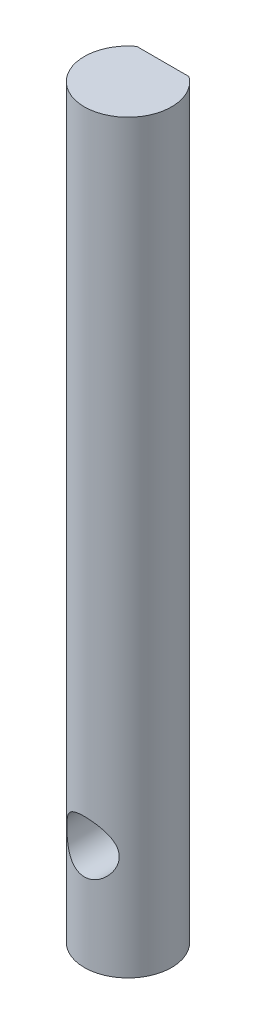
ISO-10303-21;
HEADER;
FILE_DESCRIPTION(('STEP AP214'),'2;1');
FILE_NAME('part.step','',(''),(''),'','','');
FILE_SCHEMA(('AUTOMOTIVE_DESIGN { 1 0 10303 214 1 1 1 1 }'));
ENDSEC;
DATA;
#1=APPLICATION_CONTEXT('core data for automotive mechanical design processes');
#2=APPLICATION_PROTOCOL_DEFINITION('international standard','automotive_design',2000,#1);
#3=PRODUCT_CONTEXT('',#1,'mechanical');
#4=PRODUCT('Part','Part','',(#3));
#5=PRODUCT_RELATED_PRODUCT_CATEGORY('part','',(#4));
#6=PRODUCT_DEFINITION_FORMATION('','',#4);
#7=PRODUCT_DEFINITION_CONTEXT('part definition',#1,'design');
#8=PRODUCT_DEFINITION('design','',#6,#7);
#9=PRODUCT_DEFINITION_SHAPE('','',#8);
#10=(LENGTH_UNIT() NAMED_UNIT(*) SI_UNIT(.MILLI.,.METRE.));
#11=(NAMED_UNIT(*) PLANE_ANGLE_UNIT() SI_UNIT($,.RADIAN.));
#12=(NAMED_UNIT(*) SI_UNIT($,.STERADIAN.) SOLID_ANGLE_UNIT());
#13=UNCERTAINTY_MEASURE_WITH_UNIT(LENGTH_MEASURE(1.E-05),#10,'distance_accuracy_value','');
#14=(GEOMETRIC_REPRESENTATION_CONTEXT(3) GLOBAL_UNCERTAINTY_ASSIGNED_CONTEXT((#13)) GLOBAL_UNIT_ASSIGNED_CONTEXT((#10,
#11,#12)) REPRESENTATION_CONTEXT('',''));
#15=CARTESIAN_POINT('',(0.,0.,0.));
#16=DIRECTION('',(0.,0.,1.));
#17=DIRECTION('',(1.,0.,0.));
#18=AXIS2_PLACEMENT_3D('',#15,#16,#17);
#19=CARTESIAN_POINT('',(0.,42.7,-2.));
#20=DIRECTION('',(0.,0.,-1.));
#21=DIRECTION('',(-1.,0.,0.));
#22=AXIS2_PLACEMENT_3D('',#19,#20,#21);
#23=PLANE('',#22);
#24=CARTESIAN_POINT('',(0.,6.,-2.));
#25=DIRECTION('',(0.,0.,-1.));
#26=DIRECTION('',(-1.,0.,0.));
#27=AXIS2_PLACEMENT_3D('',#24,#25,#26);
#28=CIRCLE('',#27,1.5);
#29=CARTESIAN_POINT('',(-1.5,6.00000000000001,-2.));
#30=VERTEX_POINT('',#29);
#31=CARTESIAN_POINT('',(1.5,6.00000000000001,-2.));
#32=VERTEX_POINT('',#31);
#33=EDGE_CURVE('E63',#30,#32,#28,.T.);
#34=ORIENTED_EDGE('',*,*,#33,.F.);
#35=DIRECTION('',(0.,-1.,0.));
#36=VECTOR('',#35,1.);
#37=CARTESIAN_POINT('',(-1.5,42.7,-2.));
#38=LINE('',#37,#36);
#39=CARTESIAN_POINT('',(-1.5,42.7,-2.));
#40=VERTEX_POINT('',#39);
#41=EDGE_CURVE('E57',#40,#30,#38,.T.);
#42=ORIENTED_EDGE('',*,*,#41,.F.);
#43=DIRECTION('',(1.,0.,0.));
#44=VECTOR('',#43,1.);
#45=CARTESIAN_POINT('',(0.,42.7,-2.));
#46=LINE('',#45,#44);
#47=CARTESIAN_POINT('',(1.5,42.7,-2.));
#48=VERTEX_POINT('',#47);
#49=EDGE_CURVE('E103',#40,#48,#46,.T.);
#50=ORIENTED_EDGE('',*,*,#49,.T.);
#51=DIRECTION('',(0.,-1.,0.));
#52=VECTOR('',#51,1.);
#53=CARTESIAN_POINT('',(1.5,42.7,-2.));
#54=LINE('',#53,#52);
#55=EDGE_CURVE('E94',#48,#32,#54,.T.);
#56=ORIENTED_EDGE('',*,*,#55,.T.);
#57=EDGE_LOOP('',(#34,#42,#50,#56));
#58=FACE_BOUND('',#57,.T.);
#59=ADVANCED_FACE('F44',(#58),#23,.T.);
#60=EDGE_CURVE('E90',#32,#30,#28,.T.);
#61=ORIENTED_EDGE('',*,*,#60,.F.);
#62=CARTESIAN_POINT('',(1.5,0.,-2.));
#63=VERTEX_POINT('',#62);
#64=EDGE_CURVE('E85',#32,#63,#54,.T.);
#65=ORIENTED_EDGE('',*,*,#64,.T.);
#66=DIRECTION('',(1.,0.,0.));
#67=VECTOR('',#66,1.);
#68=CARTESIAN_POINT('',(0.,0.,-2.));
#69=LINE('',#68,#67);
#70=CARTESIAN_POINT('',(-1.5,0.,-2.));
#71=VERTEX_POINT('',#70);
#72=EDGE_CURVE('E89',#71,#63,#69,.T.);
#73=ORIENTED_EDGE('',*,*,#72,.F.);
#74=EDGE_CURVE('E100',#30,#71,#38,.T.);
#75=ORIENTED_EDGE('',*,*,#74,.F.);
#76=EDGE_LOOP('',(#61,#65,#73,#75));
#77=FACE_BOUND('',#76,.T.);
#78=ADVANCED_FACE('F46',(#77),#23,.T.);
#79=CARTESIAN_POINT('',(0.,42.7,0.));
#80=DIRECTION('',(0.,-1.,0.));
#81=DIRECTION('',(0.,0.,-1.));
#82=AXIS2_PLACEMENT_3D('',#79,#80,#81);
#83=CYLINDRICAL_SURFACE('',#82,2.5);
#84=CARTESIAN_POINT('',(0.,4.5,2.5));
#85=CARTESIAN_POINT('',(-0.0767298334620159,4.50000409100988,2.49999625789732));
#86=CARTESIAN_POINT('',(-0.153582320644178,4.50592867092626,2.4964290461501));
#87=CARTESIAN_POINT('',(-0.304975509530679,4.52932431951533,2.48249903608568));
#88=CARTESIAN_POINT('',(-0.379510034596047,4.54682386185422,2.47211948032719));
#89=CARTESIAN_POINT('',(-0.523751827790837,4.59238636116686,2.44561558054488));
#90=CARTESIAN_POINT('',(-0.593481028226567,4.62039695816316,2.42951973272944));
#91=CARTESIAN_POINT('',(-0.72703031821466,4.68586033314103,2.39295367626407));
#92=CARTESIAN_POINT('',(-0.790851869416384,4.72331076696875,2.37248455380255));
#93=CARTESIAN_POINT('',(-0.916299278999316,4.80977482670858,2.32705360719088));
#94=CARTESIAN_POINT('',(-0.977384020081417,4.85945369535139,2.30186792195985));
#95=CARTESIAN_POINT('',(-1.09088270411891,4.96746720382827,2.25030439279634));
#96=CARTESIAN_POINT('',(-1.14328534948112,5.02581293718732,2.22392505153571));
#97=CARTESIAN_POINT('',(-1.24444996762974,5.15792351049673,2.1691106699591));
#98=CARTESIAN_POINT('',(-1.29197766378809,5.23270177098129,2.14082017703649));
#99=CARTESIAN_POINT('',(-1.37361437764896,5.39084657324312,2.08938301412124));
#100=CARTESIAN_POINT('',(-1.4077451733516,5.47419889624757,2.06622802273938));
#101=CARTESIAN_POINT('',(-1.45440601714222,5.62659645065324,2.0335462966093));
#102=CARTESIAN_POINT('',(-1.47016197246827,5.69423599861032,2.02207883137591));
#103=CARTESIAN_POINT('',(-1.49216172340475,5.83180371583036,2.00590308295503));
#104=CARTESIAN_POINT('',(-1.49841734556836,5.90172892875449,2.00118639643759));
#105=CARTESIAN_POINT('',(-1.50105508796009,6.04201149421734,1.99920922463856));
#106=CARTESIAN_POINT('',(-1.49741783408419,6.1123694250932,2.00196337012718));
#107=CARTESIAN_POINT('',(-1.48046060478828,6.25127877542759,2.01453261443741));
#108=CARTESIAN_POINT('',(-1.46713334620103,6.31982879584744,2.02435302432226));
#109=CARTESIAN_POINT('',(-1.43173921881792,6.4525302421281,2.04953186944258));
#110=CARTESIAN_POINT('',(-1.40978748666087,6.51672705392448,2.06481711652537));
#111=CARTESIAN_POINT('',(-1.35795061770837,6.64069499092812,2.09927051350828));
#112=CARTESIAN_POINT('',(-1.32806257259705,6.70046448342393,2.11844008623465));
#113=CARTESIAN_POINT('',(-1.25517983184583,6.8249840971228,2.16255327268985));
#114=CARTESIAN_POINT('',(-1.21080724397723,6.88877809295493,2.18792043372992));
#115=CARTESIAN_POINT('',(-1.11291092784003,7.00867648366702,2.23930599764381));
#116=CARTESIAN_POINT('',(-1.05937845100578,7.06477343397651,2.26532500262149));
#117=CARTESIAN_POINT('',(-0.935811834382965,7.17561298182176,2.31935504958317));
#118=CARTESIAN_POINT('',(-0.864517682704955,7.22907730601599,2.34713836268532));
#119=CARTESIAN_POINT('',(-0.712276050458997,7.32312204719791,2.39772428433981));
#120=CARTESIAN_POINT('',(-0.631333763943561,7.36370935378996,2.42052955425515));
#121=CARTESIAN_POINT('',(-0.467197585268202,7.4279321827959,2.45730392066151));
#122=CARTESIAN_POINT('',(-0.384467624173576,7.45247535571592,2.47173957439704));
#123=CARTESIAN_POINT('',(-0.215047895144636,7.48701119740538,2.49218842813551));
#124=CARTESIAN_POINT('',(-0.128363005661315,7.49702131775358,2.49821172952738));
#125=CARTESIAN_POINT('',(0.0337146143774001,7.50150784767831,2.5009057037461));
#126=CARTESIAN_POINT('',(0.109042473418721,7.49790885508517,2.49873521714286));
#127=CARTESIAN_POINT('',(0.257829401986063,7.47957414692808,2.48778712087048));
#128=CARTESIAN_POINT('',(0.331288509376108,7.46483865719419,2.47900964518037));
#129=CARTESIAN_POINT('',(0.472574932157615,7.42545656718754,2.4559479244219));
#130=CARTESIAN_POINT('',(0.540495750928486,7.40105965092653,2.44180275662555));
#131=CARTESIAN_POINT('',(0.671265749087265,7.34332262363473,2.40913880862844));
#132=CARTESIAN_POINT('',(0.73411392496391,7.30998074865333,2.39061916586511));
#133=CARTESIAN_POINT('',(0.860006262823865,7.23144302079129,2.3484549623736));
#134=CARTESIAN_POINT('',(0.922394150456838,7.18537617092161,2.3244780273988));
#135=CARTESIAN_POINT('',(1.03902603131014,7.08460860651138,2.27474265574731));
#136=CARTESIAN_POINT('',(1.09326040273738,7.02989784514746,2.2489821658636));
#137=CARTESIAN_POINT('',(1.19931996735579,6.90508960996285,2.19445423909891));
#138=CARTESIAN_POINT('',(1.24991019630915,6.8339161145345,2.16573241746291));
#139=CARTESIAN_POINT('',(1.33845238915668,6.6827839754318,2.1121618206671));
#140=CARTESIAN_POINT('',(1.37641766769781,6.60283470610721,2.0873089799769));
#141=CARTESIAN_POINT('',(1.43142578795777,6.45375697769331,2.04984909240519));
#142=CARTESIAN_POINT('',(1.4512162533619,6.38601968764141,2.03575659328729));
#143=CARTESIAN_POINT('',(1.48113663905972,6.24746792191989,2.01409605743544));
#144=CARTESIAN_POINT('',(1.49127995297631,6.17665785567217,2.00651897642721));
#145=CARTESIAN_POINT('',(1.50134130416631,6.03362305240297,1.99900446616267));
#146=CARTESIAN_POINT('',(1.50122089107869,5.96139400931296,1.99909576445937));
#147=CARTESIAN_POINT('',(1.49066472959328,5.81810556439054,2.0069771789285));
#148=CARTESIAN_POINT('',(1.48022337215759,5.7470468199194,2.0147714813882));
#149=CARTESIAN_POINT('',(1.45040174148913,5.61151158242781,2.0363318524298));
#150=CARTESIAN_POINT('',(1.43147636845351,5.54688290569313,2.04979211805581));
#151=CARTESIAN_POINT('',(1.38563242076993,5.42166274552578,2.08105501960151));
#152=CARTESIAN_POINT('',(1.35871083588479,5.36107279303945,2.09885929040482));
#153=CARTESIAN_POINT('',(1.29289245555732,5.23568014277922,2.14012990550917));
#154=CARTESIAN_POINT('',(1.25279167675753,5.17165889614569,2.16404587582639));
#155=CARTESIAN_POINT('',(1.16375698389084,5.05061992738271,2.21320127030768));
#156=CARTESIAN_POINT('',(1.11481579607798,4.99360803784744,2.23844177205021));
#157=CARTESIAN_POINT('',(1.00009777425734,4.87864905086833,2.29225690291476));
#158=CARTESIAN_POINT('',(0.932876819313905,4.82206892510381,2.32070308663658));
#159=CARTESIAN_POINT('',(0.78846243444559,4.72090214413669,2.37365428872367));
#160=CARTESIAN_POINT('',(0.711265444501541,4.67631978801521,2.39815789310936));
#161=CARTESIAN_POINT('',(0.551125230801455,4.60221419242626,2.43985578654394));
#162=CARTESIAN_POINT('',(0.468430086957216,4.57227193507317,2.45725077479787));
#163=CARTESIAN_POINT('',(0.29797330611881,4.52727530478902,2.48366273001246));
#164=CARTESIAN_POINT('',(0.210232099648614,4.51216483214301,2.49271125871485));
#165=CARTESIAN_POINT('',(0.101558096917538,4.50330254529134,2.49802001168187));
#166=CARTESIAN_POINT('',(0.0812762590282792,4.5020655826939,2.49876114656362));
#167=CARTESIAN_POINT('',(0.0406658206871136,4.50041375362914,2.49975164517367));
#168=CARTESIAN_POINT('',(0.02033721863757,4.4999989156791,2.50000099184316));
#169=CARTESIAN_POINT('',(0.,4.5,2.5));
#170=B_SPLINE_CURVE_WITH_KNOTS('',3,(#84,#85,#86,#87,#88,#89,#90,#91,#92,#93,#94,#95,#96,#97,
#98,#99,#100,#101,#102,#103,#104,#105,#106,#107,#108,#109,#110,#111,#112,#113,#114,#115,#116,
#117,#118,#119,#120,#121,#122,#123,#124,#125,#126,#127,#128,#129,#130,#131,#132,#133,#134,#135,
#136,#137,#138,#139,#140,#141,#142,#143,#144,#145,#146,#147,#148,#149,#150,#151,#152,#153,#154,
#155,#156,#157,#158,#159,#160,#161,#162,#163,#164,#165,#166,#167,#168,#169),.UNSPECIFIED.,.T.,
.F.,(4,2,2,2,2,2,2,2,2,2,2,2,2,2,2,2,2,2,2,2,2,2,2,2,2,2,2,2,2,2,2,2,2,2,2,2,2,2,2,2,2,2,4),(0.,
0.230102237548649,0.460772627520013,0.690308884600013,0.919788197992276,1.16681590732473,
1.41416257934801,1.69183813189808,1.96906040692092,2.17933829855633,2.38935420916578,
2.59978170870726,2.81036753273872,3.01823267593207,3.22617409809868,3.47046995225163,
3.71500044803674,3.99360957884692,4.27206939275325,4.5329679069656,4.79355286918236,
5.01875602722427,5.24395461863455,5.46367785689772,5.68344445659025,5.92601365818362,
6.16886690081836,6.44336762428009,6.71757792616456,6.93257787314693,7.14727888733319,
7.36278425777433,7.57840681155725,7.78364098331142,7.98895251523035,8.22578610052286,
8.46281544370208,8.73854311775519,9.01436946031985,9.28175654462677,9.54812832184448,
9.60911473335177,9.67010326027641),.UNSPECIFIED.);
#171=CARTESIAN_POINT('',(0.,4.5,2.5));
#172=VERTEX_POINT('',#171);
#173=EDGE_CURVE('E11',#172,#172,#170,.T.);
#174=ORIENTED_EDGE('',*,*,#173,.T.);
#175=EDGE_LOOP('',(#174));
#176=FACE_BOUND('',#175,.T.);
#177=CARTESIAN_POINT('',(0.,0.,0.));
#178=DIRECTION('',(0.,1.,0.));
#179=DIRECTION('',(0.,0.,1.));
#180=AXIS2_PLACEMENT_3D('',#177,#178,#179);
#181=CIRCLE('',#180,2.5);
#182=EDGE_CURVE('E97',#71,#63,#181,.T.);
#183=ORIENTED_EDGE('',*,*,#182,.T.);
#184=ORIENTED_EDGE('',*,*,#64,.F.);
#185=ORIENTED_EDGE('',*,*,#55,.F.);
#186=CARTESIAN_POINT('',(0.,42.7,0.));
#187=DIRECTION('',(0.,1.,0.));
#188=DIRECTION('',(0.,0.,1.));
#189=AXIS2_PLACEMENT_3D('',#186,#187,#188);
#190=CIRCLE('',#189,2.5);
#191=EDGE_CURVE('E71',#40,#48,#190,.T.);
#192=ORIENTED_EDGE('',*,*,#191,.F.);
#193=ORIENTED_EDGE('',*,*,#41,.T.);
#194=ORIENTED_EDGE('',*,*,#74,.T.);
#195=EDGE_LOOP('',(#183,#184,#185,#192,#193,#194));
#196=FACE_BOUND('',#195,.T.);
#197=ADVANCED_FACE('F98',(#176,#196),#83,.T.);
#198=CARTESIAN_POINT('',(0.,42.7,0.));
#199=DIRECTION('',(0.,1.,0.));
#200=DIRECTION('',(0.,0.,1.));
#201=AXIS2_PLACEMENT_3D('',#198,#199,#200);
#202=PLANE('',#201);
#203=ORIENTED_EDGE('',*,*,#49,.F.);
#204=ORIENTED_EDGE('',*,*,#191,.T.);
#205=EDGE_LOOP('',(#203,#204));
#206=FACE_BOUND('',#205,.T.);
#207=ADVANCED_FACE('F122',(#206),#202,.T.);
#208=CARTESIAN_POINT('',(0.,0.,0.));
#209=DIRECTION('',(0.,1.,0.));
#210=DIRECTION('',(0.,0.,1.));
#211=AXIS2_PLACEMENT_3D('',#208,#209,#210);
#212=PLANE('',#211);
#213=ORIENTED_EDGE('',*,*,#72,.T.);
#214=ORIENTED_EDGE('',*,*,#182,.F.);
#215=EDGE_LOOP('',(#213,#214));
#216=FACE_BOUND('',#215,.T.);
#217=ADVANCED_FACE('F105',(#216),#212,.F.);
#218=CARTESIAN_POINT('',(0.,6.,2.5));
#219=DIRECTION('',(0.,0.,-1.));
#220=DIRECTION('',(-1.,0.,0.));
#221=AXIS2_PLACEMENT_3D('',#218,#219,#220);
#222=CYLINDRICAL_SURFACE('',#221,1.5);
#223=ORIENTED_EDGE('',*,*,#33,.T.);
#224=ORIENTED_EDGE('',*,*,#60,.T.);
#225=EDGE_LOOP('',(#223,#224));
#226=FACE_BOUND('',#225,.T.);
#227=ORIENTED_EDGE('',*,*,#173,.F.);
#228=EDGE_LOOP('',(#227));
#229=FACE_BOUND('',#228,.T.);
#230=ADVANCED_FACE('F120',(#226,#229),#222,.F.);
#231=CLOSED_SHELL('',(#59,#78,#197,#207,#217,#230));
#232=MANIFOLD_SOLID_BREP('B2',#231);
#233=ADVANCED_BREP_SHAPE_REPRESENTATION('',(#18,#232),#14);
#234=SHAPE_DEFINITION_REPRESENTATION(#9,#233);
ENDSEC;
END-ISO-10303-21;
